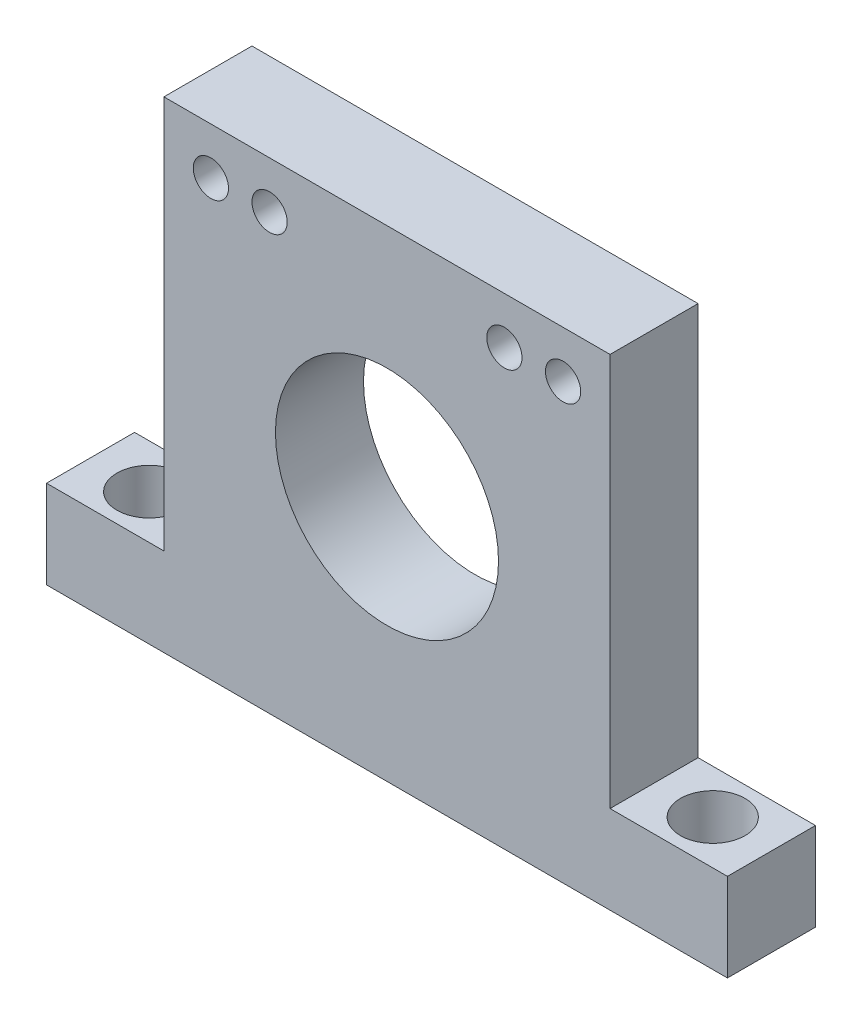
ISO-10303-21;
HEADER;
FILE_DESCRIPTION(('STEP AP214'),'2;1');
FILE_NAME('part.step','',(''),(''),'','','');
FILE_SCHEMA(('AUTOMOTIVE_DESIGN { 1 0 10303 214 1 1 1 1 }'));
ENDSEC;
DATA;
#1=APPLICATION_CONTEXT('core data for automotive mechanical design processes');
#2=APPLICATION_PROTOCOL_DEFINITION('international standard','automotive_design',2000,#1);
#3=PRODUCT_CONTEXT('',#1,'mechanical');
#4=PRODUCT('Part','Part','',(#3));
#5=PRODUCT_RELATED_PRODUCT_CATEGORY('part','',(#4));
#6=PRODUCT_DEFINITION_FORMATION('','',#4);
#7=PRODUCT_DEFINITION_CONTEXT('part definition',#1,'design');
#8=PRODUCT_DEFINITION('design','',#6,#7);
#9=PRODUCT_DEFINITION_SHAPE('','',#8);
#10=(LENGTH_UNIT() NAMED_UNIT(*) SI_UNIT(.MILLI.,.METRE.));
#11=(NAMED_UNIT(*) PLANE_ANGLE_UNIT() SI_UNIT($,.RADIAN.));
#12=(NAMED_UNIT(*) SI_UNIT($,.STERADIAN.) SOLID_ANGLE_UNIT());
#13=UNCERTAINTY_MEASURE_WITH_UNIT(LENGTH_MEASURE(1.E-05),#10,'distance_accuracy_value','');
#14=(GEOMETRIC_REPRESENTATION_CONTEXT(3) GLOBAL_UNCERTAINTY_ASSIGNED_CONTEXT((#13)) GLOBAL_UNIT_ASSIGNED_CONTEXT((#10,
#11,#12)) REPRESENTATION_CONTEXT('',''));
#15=CARTESIAN_POINT('',(0.,0.,0.));
#16=DIRECTION('',(0.,0.,1.));
#17=DIRECTION('',(1.,0.,0.));
#18=AXIS2_PLACEMENT_3D('',#15,#16,#17);
#19=CARTESIAN_POINT('',(-19.,41.,-7.50000000000001));
#20=DIRECTION('',(-1.,0.,0.));
#21=DIRECTION('',(0.,-1.,0.));
#22=AXIS2_PLACEMENT_3D('',#19,#20,#21);
#23=PLANE('',#22);
#24=DIRECTION('',(0.,-1.,0.));
#25=VECTOR('',#24,1.);
#26=CARTESIAN_POINT('',(-19.,41.,0.));
#27=LINE('',#26,#25);
#28=CARTESIAN_POINT('',(-19.,41.,0.));
#29=VERTEX_POINT('',#28);
#30=CARTESIAN_POINT('',(-19.,7.50000000000003,0.));
#31=VERTEX_POINT('',#30);
#32=EDGE_CURVE('E138',#29,#31,#27,.T.);
#33=ORIENTED_EDGE('',*,*,#32,.F.);
#34=DIRECTION('',(0.,0.,1.));
#35=VECTOR('',#34,1.);
#36=CARTESIAN_POINT('',(-19.,41.,-7.50000000000001));
#37=LINE('',#36,#35);
#38=CARTESIAN_POINT('',(-19.,41.,-7.50000000000001));
#39=VERTEX_POINT('',#38);
#40=EDGE_CURVE('E11',#39,#29,#37,.T.);
#41=ORIENTED_EDGE('',*,*,#40,.F.);
#42=DIRECTION('',(0.,-1.,0.));
#43=VECTOR('',#42,1.);
#44=CARTESIAN_POINT('',(-19.,41.,-7.50000000000001));
#45=LINE('',#44,#43);
#46=CARTESIAN_POINT('',(-19.,7.50000000000003,-7.50000000000001));
#47=VERTEX_POINT('',#46);
#48=EDGE_CURVE('E159',#39,#47,#45,.T.);
#49=ORIENTED_EDGE('',*,*,#48,.T.);
#50=DIRECTION('',(0.,0.,1.));
#51=VECTOR('',#50,1.);
#52=CARTESIAN_POINT('',(-19.,7.50000000000003,-7.50000000000001));
#53=LINE('',#52,#51);
#54=EDGE_CURVE('E44',#47,#31,#53,.T.);
#55=ORIENTED_EDGE('',*,*,#54,.T.);
#56=EDGE_LOOP('',(#33,#41,#49,#55));
#57=FACE_BOUND('',#56,.T.);
#58=ADVANCED_FACE('F41',(#57),#23,.T.);
#59=CARTESIAN_POINT('',(19.,41.,-7.50000000000003));
#60=DIRECTION('',(0.,1.,0.));
#61=DIRECTION('',(0.,0.,1.));
#62=AXIS2_PLACEMENT_3D('',#59,#60,#61);
#63=PLANE('',#62);
#64=DIRECTION('',(-1.,0.,0.));
#65=VECTOR('',#64,1.);
#66=CARTESIAN_POINT('',(19.,41.,0.));
#67=LINE('',#66,#65);
#68=CARTESIAN_POINT('',(19.,41.,0.));
#69=VERTEX_POINT('',#68);
#70=EDGE_CURVE('E157',#69,#29,#67,.T.);
#71=ORIENTED_EDGE('',*,*,#70,.F.);
#72=DIRECTION('',(0.,0.,1.));
#73=VECTOR('',#72,1.);
#74=CARTESIAN_POINT('',(19.,41.,-7.50000000000003));
#75=LINE('',#74,#73);
#76=CARTESIAN_POINT('',(19.,41.,-7.50000000000003));
#77=VERTEX_POINT('',#76);
#78=EDGE_CURVE('E50',#77,#69,#75,.T.);
#79=ORIENTED_EDGE('',*,*,#78,.F.);
#80=DIRECTION('',(-1.,0.,0.));
#81=VECTOR('',#80,1.);
#82=CARTESIAN_POINT('',(19.,41.,-7.50000000000003));
#83=LINE('',#82,#81);
#84=EDGE_CURVE('E128',#77,#39,#83,.T.);
#85=ORIENTED_EDGE('',*,*,#84,.T.);
#86=ORIENTED_EDGE('',*,*,#40,.T.);
#87=EDGE_LOOP('',(#71,#79,#85,#86));
#88=FACE_BOUND('',#87,.T.);
#89=ADVANCED_FACE('F171',(#88),#63,.T.);
#90=CARTESIAN_POINT('',(19.,7.50000000000001,-7.50000000000005));
#91=DIRECTION('',(1.,0.,0.));
#92=DIRECTION('',(0.,1.,0.));
#93=AXIS2_PLACEMENT_3D('',#90,#91,#92);
#94=PLANE('',#93);
#95=DIRECTION('',(0.,1.,0.));
#96=VECTOR('',#95,1.);
#97=CARTESIAN_POINT('',(19.,7.50000000000003,0.));
#98=LINE('',#97,#96);
#99=CARTESIAN_POINT('',(19.,7.50000000000003,0.));
#100=VERTEX_POINT('',#99);
#101=EDGE_CURVE('E115',#100,#69,#98,.T.);
#102=ORIENTED_EDGE('',*,*,#101,.F.);
#103=DIRECTION('',(0.,0.,1.));
#104=VECTOR('',#103,1.);
#105=CARTESIAN_POINT('',(19.,7.50000000000001,-7.50000000000005));
#106=LINE('',#105,#104);
#107=CARTESIAN_POINT('',(19.,7.50000000000001,-7.50000000000005));
#108=VERTEX_POINT('',#107);
#109=EDGE_CURVE('E110',#108,#100,#106,.T.);
#110=ORIENTED_EDGE('',*,*,#109,.F.);
#111=DIRECTION('',(0.,1.,0.));
#112=VECTOR('',#111,1.);
#113=CARTESIAN_POINT('',(19.,7.50000000000001,-7.50000000000005));
#114=LINE('',#113,#112);
#115=EDGE_CURVE('E113',#108,#77,#114,.T.);
#116=ORIENTED_EDGE('',*,*,#115,.T.);
#117=ORIENTED_EDGE('',*,*,#78,.T.);
#118=EDGE_LOOP('',(#102,#110,#116,#117));
#119=FACE_BOUND('',#118,.T.);
#120=ADVANCED_FACE('F112',(#119),#94,.T.);
#121=CARTESIAN_POINT('',(29.,7.50000000000003,-7.50000000000003));
#122=DIRECTION('',(0.,1.,0.));
#123=DIRECTION('',(-1.,0.,0.));
#124=AXIS2_PLACEMENT_3D('',#121,#122,#123);
#125=PLANE('',#124);
#126=CARTESIAN_POINT('',(24.,7.50000000000006,-3.75000000000003));
#127=DIRECTION('',(0.,1.,0.));
#128=DIRECTION('',(-1.,0.,0.));
#129=AXIS2_PLACEMENT_3D('',#126,#127,#128);
#130=CIRCLE('',#129,2.75);
#131=CARTESIAN_POINT('',(21.25,7.50000000000006,-3.75000000000003));
#132=VERTEX_POINT('',#131);
#133=EDGE_CURVE('E207',#132,#132,#130,.T.);
#134=ORIENTED_EDGE('',*,*,#133,.F.);
#135=EDGE_LOOP('',(#134));
#136=FACE_BOUND('',#135,.T.);
#137=DIRECTION('',(-1.,0.,0.));
#138=VECTOR('',#137,1.);
#139=CARTESIAN_POINT('',(29.,7.50000000000003,0.));
#140=LINE('',#139,#138);
#141=CARTESIAN_POINT('',(29.,7.50000000000003,0.));
#142=VERTEX_POINT('',#141);
#143=EDGE_CURVE('E154',#142,#100,#140,.T.);
#144=ORIENTED_EDGE('',*,*,#143,.F.);
#145=DIRECTION('',(0.,0.,1.));
#146=VECTOR('',#145,1.);
#147=CARTESIAN_POINT('',(29.,7.50000000000003,-7.50000000000003));
#148=LINE('',#147,#146);
#149=CARTESIAN_POINT('',(29.,7.50000000000003,-7.50000000000003));
#150=VERTEX_POINT('',#149);
#151=EDGE_CURVE('E120',#150,#142,#148,.T.);
#152=ORIENTED_EDGE('',*,*,#151,.F.);
#153=DIRECTION('',(-1.,0.,0.));
#154=VECTOR('',#153,1.);
#155=CARTESIAN_POINT('',(29.,7.50000000000003,-7.50000000000003));
#156=LINE('',#155,#154);
#157=EDGE_CURVE('E126',#150,#108,#156,.T.);
#158=ORIENTED_EDGE('',*,*,#157,.T.);
#159=ORIENTED_EDGE('',*,*,#109,.T.);
#160=EDGE_LOOP('',(#144,#152,#158,#159));
#161=FACE_BOUND('',#160,.T.);
#162=ADVANCED_FACE('F130',(#136,#161),#125,.T.);
#163=CARTESIAN_POINT('',(29.,0.,-7.50000000000001));
#164=DIRECTION('',(1.,0.,0.));
#165=DIRECTION('',(0.,0.,-1.));
#166=AXIS2_PLACEMENT_3D('',#163,#164,#165);
#167=PLANE('',#166);
#168=DIRECTION('',(0.,1.,0.));
#169=VECTOR('',#168,1.);
#170=CARTESIAN_POINT('',(29.,0.,0.));
#171=LINE('',#170,#169);
#172=CARTESIAN_POINT('',(29.,0.,0.));
#173=VERTEX_POINT('',#172);
#174=EDGE_CURVE('E151',#173,#142,#171,.T.);
#175=ORIENTED_EDGE('',*,*,#174,.F.);
#176=DIRECTION('',(0.,0.,1.));
#177=VECTOR('',#176,1.);
#178=CARTESIAN_POINT('',(29.,0.,-7.50000000000001));
#179=LINE('',#178,#177);
#180=CARTESIAN_POINT('',(29.,0.,-7.50000000000001));
#181=VERTEX_POINT('',#180);
#182=EDGE_CURVE('E163',#181,#173,#179,.T.);
#183=ORIENTED_EDGE('',*,*,#182,.F.);
#184=DIRECTION('',(0.,1.,0.));
#185=VECTOR('',#184,1.);
#186=CARTESIAN_POINT('',(29.,0.,-7.50000000000001));
#187=LINE('',#186,#185);
#188=EDGE_CURVE('E131',#181,#150,#187,.T.);
#189=ORIENTED_EDGE('',*,*,#188,.T.);
#190=ORIENTED_EDGE('',*,*,#151,.T.);
#191=EDGE_LOOP('',(#175,#183,#189,#190));
#192=FACE_BOUND('',#191,.T.);
#193=ADVANCED_FACE('F184',(#192),#167,.T.);
#194=CARTESIAN_POINT('',(-29.,0.,-7.50000000000001));
#195=DIRECTION('',(0.,-1.,0.));
#196=DIRECTION('',(1.,0.,0.));
#197=AXIS2_PLACEMENT_3D('',#194,#195,#196);
#198=PLANE('',#197);
#199=CARTESIAN_POINT('',(-24.,0.,-3.75));
#200=DIRECTION('',(0.,1.,0.));
#201=DIRECTION('',(-1.,0.,0.));
#202=AXIS2_PLACEMENT_3D('',#199,#200,#201);
#203=CIRCLE('',#202,2.75);
#204=CARTESIAN_POINT('',(-26.75,0.,-3.75));
#205=VERTEX_POINT('',#204);
#206=EDGE_CURVE('E206',#205,#205,#203,.T.);
#207=ORIENTED_EDGE('',*,*,#206,.T.);
#208=EDGE_LOOP('',(#207));
#209=FACE_BOUND('',#208,.T.);
#210=CARTESIAN_POINT('',(24.,0.,-3.75000000000003));
#211=DIRECTION('',(0.,1.,0.));
#212=DIRECTION('',(-1.,0.,0.));
#213=AXIS2_PLACEMENT_3D('',#210,#211,#212);
#214=CIRCLE('',#213,2.75);
#215=CARTESIAN_POINT('',(21.25,0.,-3.75000000000003));
#216=VERTEX_POINT('',#215);
#217=EDGE_CURVE('E213',#216,#216,#214,.T.);
#218=ORIENTED_EDGE('',*,*,#217,.T.);
#219=EDGE_LOOP('',(#218));
#220=FACE_BOUND('',#219,.T.);
#221=DIRECTION('',(1.,0.,0.));
#222=VECTOR('',#221,1.);
#223=CARTESIAN_POINT('',(-29.,0.,0.));
#224=LINE('',#223,#222);
#225=CARTESIAN_POINT('',(-29.,0.,0.));
#226=VERTEX_POINT('',#225);
#227=EDGE_CURVE('E148',#226,#173,#224,.T.);
#228=ORIENTED_EDGE('',*,*,#227,.F.);
#229=DIRECTION('',(0.,0.,1.));
#230=VECTOR('',#229,1.);
#231=CARTESIAN_POINT('',(-29.,0.,-7.50000000000001));
#232=LINE('',#231,#230);
#233=CARTESIAN_POINT('',(-29.,0.,-7.50000000000001));
#234=VERTEX_POINT('',#233);
#235=EDGE_CURVE('E165',#234,#226,#232,.T.);
#236=ORIENTED_EDGE('',*,*,#235,.F.);
#237=DIRECTION('',(1.,0.,0.));
#238=VECTOR('',#237,1.);
#239=CARTESIAN_POINT('',(-29.,0.,-7.50000000000001));
#240=LINE('',#239,#238);
#241=EDGE_CURVE('E133',#234,#181,#240,.T.);
#242=ORIENTED_EDGE('',*,*,#241,.T.);
#243=ORIENTED_EDGE('',*,*,#182,.T.);
#244=EDGE_LOOP('',(#228,#236,#242,#243));
#245=FACE_BOUND('',#244,.T.);
#246=ADVANCED_FACE('F188',(#209,#220,#245),#198,.T.);
#247=CARTESIAN_POINT('',(-29.,7.49999999999998,-7.50000000000003));
#248=DIRECTION('',(-1.,0.,0.));
#249=DIRECTION('',(0.,0.,1.));
#250=AXIS2_PLACEMENT_3D('',#247,#248,#249);
#251=PLANE('',#250);
#252=DIRECTION('',(0.,-1.,0.));
#253=VECTOR('',#252,1.);
#254=CARTESIAN_POINT('',(-29.,7.50000000000003,0.));
#255=LINE('',#254,#253);
#256=CARTESIAN_POINT('',(-29.,7.50000000000003,0.));
#257=VERTEX_POINT('',#256);
#258=EDGE_CURVE('E145',#257,#226,#255,.T.);
#259=ORIENTED_EDGE('',*,*,#258,.F.);
#260=DIRECTION('',(0.,0.,1.));
#261=VECTOR('',#260,1.);
#262=CARTESIAN_POINT('',(-29.,7.49999999999998,-7.50000000000003));
#263=LINE('',#262,#261);
#264=CARTESIAN_POINT('',(-29.,7.49999999999998,-7.50000000000003));
#265=VERTEX_POINT('',#264);
#266=EDGE_CURVE('E166',#265,#257,#263,.T.);
#267=ORIENTED_EDGE('',*,*,#266,.F.);
#268=DIRECTION('',(0.,-1.,0.));
#269=VECTOR('',#268,1.);
#270=CARTESIAN_POINT('',(-29.,7.49999999999998,-7.50000000000003));
#271=LINE('',#270,#269);
#272=EDGE_CURVE('E249',#265,#234,#271,.T.);
#273=ORIENTED_EDGE('',*,*,#272,.T.);
#274=ORIENTED_EDGE('',*,*,#235,.T.);
#275=EDGE_LOOP('',(#259,#267,#273,#274));
#276=FACE_BOUND('',#275,.T.);
#277=ADVANCED_FACE('F192',(#276),#251,.T.);
#278=CARTESIAN_POINT('',(-19.,7.50000000000003,-7.50000000000001));
#279=DIRECTION('',(0.,1.,0.));
#280=DIRECTION('',(-1.,0.,0.));
#281=AXIS2_PLACEMENT_3D('',#278,#279,#280);
#282=PLANE('',#281);
#283=CARTESIAN_POINT('',(-24.,7.49999999999998,-3.75));
#284=DIRECTION('',(0.,1.,0.));
#285=DIRECTION('',(-1.,0.,0.));
#286=AXIS2_PLACEMENT_3D('',#283,#284,#285);
#287=CIRCLE('',#286,2.75);
#288=CARTESIAN_POINT('',(-26.75,7.49999999999998,-3.75));
#289=VERTEX_POINT('',#288);
#290=EDGE_CURVE('E204',#289,#289,#287,.T.);
#291=ORIENTED_EDGE('',*,*,#290,.F.);
#292=EDGE_LOOP('',(#291));
#293=FACE_BOUND('',#292,.T.);
#294=DIRECTION('',(-1.,0.,0.));
#295=VECTOR('',#294,1.);
#296=CARTESIAN_POINT('',(-19.,7.50000000000003,0.));
#297=LINE('',#296,#295);
#298=EDGE_CURVE('E141',#31,#257,#297,.T.);
#299=ORIENTED_EDGE('',*,*,#298,.F.);
#300=ORIENTED_EDGE('',*,*,#54,.F.);
#301=DIRECTION('',(-1.,0.,0.));
#302=VECTOR('',#301,1.);
#303=CARTESIAN_POINT('',(-19.,7.50000000000003,-7.50000000000001));
#304=LINE('',#303,#302);
#305=EDGE_CURVE('E247',#47,#265,#304,.T.);
#306=ORIENTED_EDGE('',*,*,#305,.T.);
#307=ORIENTED_EDGE('',*,*,#266,.T.);
#308=EDGE_LOOP('',(#299,#300,#306,#307));
#309=FACE_BOUND('',#308,.T.);
#310=ADVANCED_FACE('F168',(#293,#309),#282,.T.);
#311=CARTESIAN_POINT('',(0.,0.,-7.50000000000001));
#312=DIRECTION('',(0.,0.,-1.));
#313=DIRECTION('',(-1.,0.,0.));
#314=AXIS2_PLACEMENT_3D('',#311,#312,#313);
#315=PLANE('',#314);
#316=CARTESIAN_POINT('',(15.,37.,-7.50000000000003));
#317=DIRECTION('',(0.,0.,1.));
#318=DIRECTION('',(1.,0.,0.));
#319=AXIS2_PLACEMENT_3D('',#316,#317,#318);
#320=CIRCLE('',#319,1.5);
#321=CARTESIAN_POINT('',(16.5,37.,-7.50000000000003));
#322=VERTEX_POINT('',#321);
#323=EDGE_CURVE('E218',#322,#322,#320,.T.);
#324=ORIENTED_EDGE('',*,*,#323,.T.);
#325=EDGE_LOOP('',(#324));
#326=FACE_BOUND('',#325,.T.);
#327=CARTESIAN_POINT('',(-10.,37.,-7.50000000000003));
#328=DIRECTION('',(0.,0.,1.));
#329=DIRECTION('',(-1.,0.,0.));
#330=AXIS2_PLACEMENT_3D('',#327,#328,#329);
#331=CIRCLE('',#330,1.5);
#332=CARTESIAN_POINT('',(-11.5,37.,-7.50000000000003));
#333=VERTEX_POINT('',#332);
#334=EDGE_CURVE('E210',#333,#333,#331,.T.);
#335=ORIENTED_EDGE('',*,*,#334,.T.);
#336=EDGE_LOOP('',(#335));
#337=FACE_BOUND('',#336,.T.);
#338=CARTESIAN_POINT('',(-15.0000000000001,37.,-7.50000000000003));
#339=DIRECTION('',(0.,0.,1.));
#340=DIRECTION('',(-1.,0.,0.));
#341=AXIS2_PLACEMENT_3D('',#338,#339,#340);
#342=CIRCLE('',#341,1.5);
#343=CARTESIAN_POINT('',(-16.5000000000001,37.,-7.50000000000003));
#344=VERTEX_POINT('',#343);
#345=EDGE_CURVE('E229',#344,#344,#342,.T.);
#346=ORIENTED_EDGE('',*,*,#345,.T.);
#347=EDGE_LOOP('',(#346));
#348=FACE_BOUND('',#347,.T.);
#349=CARTESIAN_POINT('',(10.,37.,-7.50000000000003));
#350=DIRECTION('',(0.,0.,1.));
#351=DIRECTION('',(1.,0.,0.));
#352=AXIS2_PLACEMENT_3D('',#349,#350,#351);
#353=CIRCLE('',#352,1.5);
#354=CARTESIAN_POINT('',(11.5,37.,-7.50000000000003));
#355=VERTEX_POINT('',#354);
#356=EDGE_CURVE('E234',#355,#355,#353,.T.);
#357=ORIENTED_EDGE('',*,*,#356,.T.);
#358=EDGE_LOOP('',(#357));
#359=FACE_BOUND('',#358,.T.);
#360=CARTESIAN_POINT('',(0.,21.,-7.50000000000001));
#361=DIRECTION('',(0.,0.,1.));
#362=DIRECTION('',(1.,0.,0.));
#363=AXIS2_PLACEMENT_3D('',#360,#361,#362);
#364=CIRCLE('',#363,9.5);
#365=CARTESIAN_POINT('',(9.5,21.,-7.50000000000001));
#366=VERTEX_POINT('',#365);
#367=EDGE_CURVE('E142',#366,#366,#364,.T.);
#368=ORIENTED_EDGE('',*,*,#367,.T.);
#369=EDGE_LOOP('',(#368));
#370=FACE_BOUND('',#369,.T.);
#371=ORIENTED_EDGE('',*,*,#48,.F.);
#372=ORIENTED_EDGE('',*,*,#84,.F.);
#373=ORIENTED_EDGE('',*,*,#115,.F.);
#374=ORIENTED_EDGE('',*,*,#157,.F.);
#375=ORIENTED_EDGE('',*,*,#188,.F.);
#376=ORIENTED_EDGE('',*,*,#241,.F.);
#377=ORIENTED_EDGE('',*,*,#272,.F.);
#378=ORIENTED_EDGE('',*,*,#305,.F.);
#379=EDGE_LOOP('',(#371,#372,#373,#374,#375,#376,#377,#378));
#380=FACE_BOUND('',#379,.T.);
#381=ADVANCED_FACE('F124',(#326,#337,#348,#359,#370,#380),#315,.T.);
#382=CARTESIAN_POINT('',(0.,0.,0.));
#383=DIRECTION('',(0.,0.,-1.));
#384=DIRECTION('',(-1.,0.,0.));
#385=AXIS2_PLACEMENT_3D('',#382,#383,#384);
#386=PLANE('',#385);
#387=CARTESIAN_POINT('',(15.,37.,0.));
#388=DIRECTION('',(0.,0.,1.));
#389=DIRECTION('',(1.,0.,0.));
#390=AXIS2_PLACEMENT_3D('',#387,#388,#389);
#391=CIRCLE('',#390,1.5);
#392=CARTESIAN_POINT('',(16.5,37.,0.));
#393=VERTEX_POINT('',#392);
#394=EDGE_CURVE('E222',#393,#393,#391,.T.);
#395=ORIENTED_EDGE('',*,*,#394,.F.);
#396=EDGE_LOOP('',(#395));
#397=FACE_BOUND('',#396,.T.);
#398=CARTESIAN_POINT('',(-9.99999999999998,37.,0.));
#399=DIRECTION('',(0.,0.,1.));
#400=DIRECTION('',(-1.,0.,0.));
#401=AXIS2_PLACEMENT_3D('',#398,#399,#400);
#402=CIRCLE('',#401,1.5);
#403=CARTESIAN_POINT('',(-11.5,37.,0.));
#404=VERTEX_POINT('',#403);
#405=EDGE_CURVE('E226',#404,#404,#402,.T.);
#406=ORIENTED_EDGE('',*,*,#405,.F.);
#407=EDGE_LOOP('',(#406));
#408=FACE_BOUND('',#407,.T.);
#409=CARTESIAN_POINT('',(-15.,37.,0.));
#410=DIRECTION('',(0.,0.,1.));
#411=DIRECTION('',(-1.,0.,0.));
#412=AXIS2_PLACEMENT_3D('',#409,#410,#411);
#413=CIRCLE('',#412,1.5);
#414=CARTESIAN_POINT('',(-16.5,37.,0.));
#415=VERTEX_POINT('',#414);
#416=EDGE_CURVE('E237',#415,#415,#413,.T.);
#417=ORIENTED_EDGE('',*,*,#416,.F.);
#418=EDGE_LOOP('',(#417));
#419=FACE_BOUND('',#418,.T.);
#420=CARTESIAN_POINT('',(9.99999999999997,37.,0.));
#421=DIRECTION('',(0.,0.,1.));
#422=DIRECTION('',(1.,0.,0.));
#423=AXIS2_PLACEMENT_3D('',#420,#421,#422);
#424=CIRCLE('',#423,1.5);
#425=CARTESIAN_POINT('',(11.5,37.,0.));
#426=VERTEX_POINT('',#425);
#427=EDGE_CURVE('E225',#426,#426,#424,.T.);
#428=ORIENTED_EDGE('',*,*,#427,.F.);
#429=EDGE_LOOP('',(#428));
#430=FACE_BOUND('',#429,.T.);
#431=CARTESIAN_POINT('',(0.,21.,0.));
#432=DIRECTION('',(0.,0.,1.));
#433=DIRECTION('',(1.,0.,0.));
#434=AXIS2_PLACEMENT_3D('',#431,#432,#433);
#435=CIRCLE('',#434,9.5);
#436=CARTESIAN_POINT('',(9.50000000000003,21.,0.));
#437=VERTEX_POINT('',#436);
#438=EDGE_CURVE('E221',#437,#437,#435,.T.);
#439=ORIENTED_EDGE('',*,*,#438,.F.);
#440=EDGE_LOOP('',(#439));
#441=FACE_BOUND('',#440,.T.);
#442=ORIENTED_EDGE('',*,*,#32,.T.);
#443=ORIENTED_EDGE('',*,*,#298,.T.);
#444=ORIENTED_EDGE('',*,*,#258,.T.);
#445=ORIENTED_EDGE('',*,*,#227,.T.);
#446=ORIENTED_EDGE('',*,*,#174,.T.);
#447=ORIENTED_EDGE('',*,*,#143,.T.);
#448=ORIENTED_EDGE('',*,*,#101,.T.);
#449=ORIENTED_EDGE('',*,*,#70,.T.);
#450=EDGE_LOOP('',(#442,#443,#444,#445,#446,#447,#448,#449));
#451=FACE_BOUND('',#450,.T.);
#452=ADVANCED_FACE('F170',(#397,#408,#419,#430,#441,#451),#386,.F.);
#453=CARTESIAN_POINT('',(0.,21.,-7.50000000000001));
#454=DIRECTION('',(0.,0.,1.));
#455=DIRECTION('',(1.,0.,0.));
#456=AXIS2_PLACEMENT_3D('',#453,#454,#455);
#457=CYLINDRICAL_SURFACE('',#456,9.5);
#458=ORIENTED_EDGE('',*,*,#367,.F.);
#459=EDGE_LOOP('',(#458));
#460=FACE_BOUND('',#459,.T.);
#461=ORIENTED_EDGE('',*,*,#438,.T.);
#462=EDGE_LOOP('',(#461));
#463=FACE_BOUND('',#462,.T.);
#464=ADVANCED_FACE('F259',(#460,#463),#457,.F.);
#465=CARTESIAN_POINT('',(10.,37.,-7.50000000000003));
#466=DIRECTION('',(0.,0.,1.));
#467=DIRECTION('',(1.,0.,0.));
#468=AXIS2_PLACEMENT_3D('',#465,#466,#467);
#469=CYLINDRICAL_SURFACE('',#468,1.5);
#470=ORIENTED_EDGE('',*,*,#356,.F.);
#471=EDGE_LOOP('',(#470));
#472=FACE_BOUND('',#471,.T.);
#473=ORIENTED_EDGE('',*,*,#427,.T.);
#474=EDGE_LOOP('',(#473));
#475=FACE_BOUND('',#474,.T.);
#476=ADVANCED_FACE('F266',(#472,#475),#469,.F.);
#477=CARTESIAN_POINT('',(-15.0000000000001,37.,-7.50000000000003));
#478=DIRECTION('',(0.,0.,1.));
#479=DIRECTION('',(1.,0.,0.));
#480=AXIS2_PLACEMENT_3D('',#477,#478,#479);
#481=CYLINDRICAL_SURFACE('',#480,1.5);
#482=ORIENTED_EDGE('',*,*,#345,.F.);
#483=EDGE_LOOP('',(#482));
#484=FACE_BOUND('',#483,.T.);
#485=ORIENTED_EDGE('',*,*,#416,.T.);
#486=EDGE_LOOP('',(#485));
#487=FACE_BOUND('',#486,.T.);
#488=ADVANCED_FACE('F278',(#484,#487),#481,.F.);
#489=CARTESIAN_POINT('',(-10.,37.,-7.50000000000003));
#490=DIRECTION('',(0.,0.,1.));
#491=DIRECTION('',(1.,0.,0.));
#492=AXIS2_PLACEMENT_3D('',#489,#490,#491);
#493=CYLINDRICAL_SURFACE('',#492,1.5);
#494=ORIENTED_EDGE('',*,*,#334,.F.);
#495=EDGE_LOOP('',(#494));
#496=FACE_BOUND('',#495,.T.);
#497=ORIENTED_EDGE('',*,*,#405,.T.);
#498=EDGE_LOOP('',(#497));
#499=FACE_BOUND('',#498,.T.);
#500=ADVANCED_FACE('F284',(#496,#499),#493,.F.);
#501=CARTESIAN_POINT('',(15.,37.,-7.50000000000003));
#502=DIRECTION('',(0.,0.,1.));
#503=DIRECTION('',(1.,0.,0.));
#504=AXIS2_PLACEMENT_3D('',#501,#502,#503);
#505=CYLINDRICAL_SURFACE('',#504,1.5);
#506=ORIENTED_EDGE('',*,*,#323,.F.);
#507=EDGE_LOOP('',(#506));
#508=FACE_BOUND('',#507,.T.);
#509=ORIENTED_EDGE('',*,*,#394,.T.);
#510=EDGE_LOOP('',(#509));
#511=FACE_BOUND('',#510,.T.);
#512=ADVANCED_FACE('F291',(#508,#511),#505,.F.);
#513=CARTESIAN_POINT('',(-24.,0.,-3.75));
#514=DIRECTION('',(0.,1.,0.));
#515=DIRECTION('',(-1.,0.,0.));
#516=AXIS2_PLACEMENT_3D('',#513,#514,#515);
#517=CYLINDRICAL_SURFACE('',#516,2.75);
#518=CARTESIAN_POINT('',(-26.75,0.,-3.75));
#519=CARTESIAN_POINT('',(-26.75,0.0781249999999994,-3.75));
#520=CARTESIAN_POINT('',(-26.75,0.156249999999999,-3.75));
#521=CARTESIAN_POINT('',(-26.75,0.312499999999999,-3.75));
#522=CARTESIAN_POINT('',(-26.75,0.390624999999999,-3.75));
#523=CARTESIAN_POINT('',(-26.75,0.546874999999998,-3.75));
#524=CARTESIAN_POINT('',(-26.75,0.624999999999998,-3.75));
#525=CARTESIAN_POINT('',(-26.75,0.781249999999997,-3.75));
#526=CARTESIAN_POINT('',(-26.75,0.859374999999997,-3.75));
#527=CARTESIAN_POINT('',(-26.75,1.015625,-3.75));
#528=CARTESIAN_POINT('',(-26.75,1.09375,-3.75));
#529=CARTESIAN_POINT('',(-26.75,1.25,-3.75));
#530=CARTESIAN_POINT('',(-26.75,1.328125,-3.75));
#531=CARTESIAN_POINT('',(-26.75,1.484375,-3.75));
#532=CARTESIAN_POINT('',(-26.75,1.5625,-3.75));
#533=CARTESIAN_POINT('',(-26.75,1.71874999999999,-3.75));
#534=CARTESIAN_POINT('',(-26.75,1.79687499999999,-3.75));
#535=CARTESIAN_POINT('',(-26.75,1.95312499999999,-3.75));
#536=CARTESIAN_POINT('',(-26.75,2.03124999999999,-3.75));
#537=CARTESIAN_POINT('',(-26.75,2.18749999999999,-3.75));
#538=CARTESIAN_POINT('',(-26.75,2.26562499999999,-3.75));
#539=CARTESIAN_POINT('',(-26.75,2.42187499999999,-3.75));
#540=CARTESIAN_POINT('',(-26.75,2.49999999999999,-3.75));
#541=CARTESIAN_POINT('',(-26.75,2.65624999999999,-3.75));
#542=CARTESIAN_POINT('',(-26.75,2.73437499999999,-3.75));
#543=CARTESIAN_POINT('',(-26.75,2.89062499999999,-3.75));
#544=CARTESIAN_POINT('',(-26.75,2.96874999999999,-3.75));
#545=CARTESIAN_POINT('',(-26.75,3.12499999999999,-3.75));
#546=CARTESIAN_POINT('',(-26.75,3.20312499999999,-3.75));
#547=CARTESIAN_POINT('',(-26.75,3.35937499999999,-3.75));
#548=CARTESIAN_POINT('',(-26.75,3.43749999999999,-3.75));
#549=CARTESIAN_POINT('',(-26.75,3.59374999999999,-3.75));
#550=CARTESIAN_POINT('',(-26.75,3.67187499999999,-3.75));
#551=CARTESIAN_POINT('',(-26.75,3.82812499999999,-3.75));
#552=CARTESIAN_POINT('',(-26.75,3.90624999999999,-3.75));
#553=CARTESIAN_POINT('',(-26.75,4.06249999999999,-3.75));
#554=CARTESIAN_POINT('',(-26.75,4.14062499999999,-3.75));
#555=CARTESIAN_POINT('',(-26.75,4.29687499999999,-3.75));
#556=CARTESIAN_POINT('',(-26.75,4.37499999999999,-3.75));
#557=CARTESIAN_POINT('',(-26.75,4.53124999999999,-3.75));
#558=CARTESIAN_POINT('',(-26.75,4.60937499999999,-3.75));
#559=CARTESIAN_POINT('',(-26.75,4.76562499999999,-3.75));
#560=CARTESIAN_POINT('',(-26.75,4.84374999999998,-3.75));
#561=CARTESIAN_POINT('',(-26.75,4.99999999999999,-3.75));
#562=CARTESIAN_POINT('',(-26.75,5.07812499999998,-3.75));
#563=CARTESIAN_POINT('',(-26.75,5.23437499999998,-3.75));
#564=CARTESIAN_POINT('',(-26.75,5.31249999999998,-3.75));
#565=CARTESIAN_POINT('',(-26.75,5.46874999999998,-3.75));
#566=CARTESIAN_POINT('',(-26.75,5.54687499999998,-3.75));
#567=CARTESIAN_POINT('',(-26.75,5.70312499999998,-3.75));
#568=CARTESIAN_POINT('',(-26.75,5.78124999999998,-3.75));
#569=CARTESIAN_POINT('',(-26.75,5.93749999999998,-3.75));
#570=CARTESIAN_POINT('',(-26.75,6.01562499999998,-3.75));
#571=CARTESIAN_POINT('',(-26.75,6.17187499999998,-3.75));
#572=CARTESIAN_POINT('',(-26.75,6.24999999999998,-3.75));
#573=CARTESIAN_POINT('',(-26.75,6.40624999999998,-3.75));
#574=CARTESIAN_POINT('',(-26.75,6.48437499999998,-3.75));
#575=CARTESIAN_POINT('',(-26.75,6.64062499999998,-3.75));
#576=CARTESIAN_POINT('',(-26.75,6.71874999999998,-3.75));
#577=CARTESIAN_POINT('',(-26.75,6.87499999999998,-3.75));
#578=CARTESIAN_POINT('',(-26.75,6.95312499999998,-3.75));
#579=CARTESIAN_POINT('',(-26.75,7.10937499999998,-3.75));
#580=CARTESIAN_POINT('',(-26.75,7.18749999999998,-3.75));
#581=CARTESIAN_POINT('',(-26.75,7.34374999999998,-3.75));
#582=CARTESIAN_POINT('',(-26.75,7.42187499999998,-3.75));
#583=CARTESIAN_POINT('',(-26.75,7.49999999999998,-3.75));
#584=B_SPLINE_CURVE_WITH_KNOTS('',3,(#518,#519,#520,#521,#522,#523,#524,#525,#526,#527,#528,
#529,#530,#531,#532,#533,#534,#535,#536,#537,#538,#539,#540,#541,#542,#543,#544,#545,#546,#547,
#548,#549,#550,#551,#552,#553,#554,#555,#556,#557,#558,#559,#560,#561,#562,#563,#564,#565,#566,
#567,#568,#569,#570,#571,#572,#573,#574,#575,#576,#577,#578,#579,#580,#581,#582,#583),
.UNSPECIFIED.,.F.,.F.,(4,2,2,2,2,2,2,2,2,2,2,2,2,2,2,2,2,2,2,2,2,2,2,2,2,2,2,2,2,2,2,2,4),(0.,
0.234374999999999,0.468749999999999,0.703124999999998,0.937499999999997,1.171875,1.40625,
1.640625,1.87499999999999,2.10937499999999,2.34374999999999,2.57812499999999,2.81249999999999,
3.04687499999999,3.28124999999999,3.51562499999999,3.74999999999999,3.98437499999999,
4.21874999999999,4.45312499999999,4.68749999999999,4.92187499999998,5.15624999999998,
5.39062499999998,5.62499999999998,5.85937499999998,6.09374999999998,6.32812499999998,
6.56249999999998,6.79687499999998,7.03124999999998,7.26562499999998,7.49999999999998),.UNSPECIFIED.);
#585=EDGE_CURVE('BSEAM295',#205,#289,#584,.T.);
#586=ORIENTED_EDGE('',*,*,#206,.F.);
#587=ORIENTED_EDGE('',*,*,#290,.T.);
#588=ORIENTED_EDGE('',*,*,#585,.T.);
#589=ORIENTED_EDGE('',*,*,#585,.F.);
#590=EDGE_LOOP('',(#586,#588,#587,#589));
#591=FACE_BOUND('',#590,.T.);
#592=ADVANCED_FACE('F295',(#591),#517,.F.);
#593=CARTESIAN_POINT('',(24.,0.,-3.75000000000003));
#594=DIRECTION('',(0.,1.,0.));
#595=DIRECTION('',(-1.,0.,0.));
#596=AXIS2_PLACEMENT_3D('',#593,#594,#595);
#597=CYLINDRICAL_SURFACE('',#596,2.75);
#598=CARTESIAN_POINT('',(21.25,0.,-3.75000000000003));
#599=CARTESIAN_POINT('',(21.25,0.0781250000000002,-3.75000000000003));
#600=CARTESIAN_POINT('',(21.25,0.156250000000001,-3.75000000000003));
#601=CARTESIAN_POINT('',(21.25,0.312500000000002,-3.75000000000003));
#602=CARTESIAN_POINT('',(21.25,0.390625000000003,-3.75000000000003));
#603=CARTESIAN_POINT('',(21.25,0.546875000000004,-3.75000000000003));
#604=CARTESIAN_POINT('',(21.25,0.625000000000005,-3.75000000000003));
#605=CARTESIAN_POINT('',(21.25,0.781250000000006,-3.75000000000003));
#606=CARTESIAN_POINT('',(21.25,0.859375000000007,-3.75000000000003));
#607=CARTESIAN_POINT('',(21.25,1.01562500000001,-3.75000000000003));
#608=CARTESIAN_POINT('',(21.25,1.09375000000001,-3.75000000000003));
#609=CARTESIAN_POINT('',(21.25,1.25000000000001,-3.75000000000003));
#610=CARTESIAN_POINT('',(21.25,1.32812500000001,-3.75000000000003));
#611=CARTESIAN_POINT('',(21.25,1.48437500000001,-3.75000000000003));
#612=CARTESIAN_POINT('',(21.25,1.56250000000001,-3.75000000000003));
#613=CARTESIAN_POINT('',(21.25,1.71875000000001,-3.75000000000003));
#614=CARTESIAN_POINT('',(21.25,1.79687500000001,-3.75000000000003));
#615=CARTESIAN_POINT('',(21.25,1.95312500000002,-3.75000000000003));
#616=CARTESIAN_POINT('',(21.25,2.03125000000002,-3.75000000000003));
#617=CARTESIAN_POINT('',(21.25,2.18750000000002,-3.75000000000003));
#618=CARTESIAN_POINT('',(21.25,2.26562500000002,-3.75000000000003));
#619=CARTESIAN_POINT('',(21.25,2.42187500000002,-3.75000000000003));
#620=CARTESIAN_POINT('',(21.25,2.50000000000002,-3.75000000000003));
#621=CARTESIAN_POINT('',(21.25,2.65625000000002,-3.75000000000003));
#622=CARTESIAN_POINT('',(21.25,2.73437500000002,-3.75000000000003));
#623=CARTESIAN_POINT('',(21.25,2.89062500000002,-3.75000000000003));
#624=CARTESIAN_POINT('',(21.25,2.96875000000002,-3.75000000000003));
#625=CARTESIAN_POINT('',(21.25,3.12500000000003,-3.75000000000003));
#626=CARTESIAN_POINT('',(21.25,3.20312500000003,-3.75000000000003));
#627=CARTESIAN_POINT('',(21.25,3.35937500000003,-3.75000000000003));
#628=CARTESIAN_POINT('',(21.25,3.43750000000003,-3.75000000000003));
#629=CARTESIAN_POINT('',(21.25,3.59375000000003,-3.75000000000003));
#630=CARTESIAN_POINT('',(21.25,3.67187500000003,-3.75000000000003));
#631=CARTESIAN_POINT('',(21.25,3.82812500000003,-3.75000000000003));
#632=CARTESIAN_POINT('',(21.25,3.90625000000003,-3.75000000000003));
#633=CARTESIAN_POINT('',(21.25,4.06250000000003,-3.75000000000003));
#634=CARTESIAN_POINT('',(21.25,4.14062500000003,-3.75000000000003));
#635=CARTESIAN_POINT('',(21.25,4.29687500000003,-3.75000000000003));
#636=CARTESIAN_POINT('',(21.25,4.37500000000004,-3.75000000000003));
#637=CARTESIAN_POINT('',(21.25,4.53125000000004,-3.75000000000003));
#638=CARTESIAN_POINT('',(21.25,4.60937500000004,-3.75000000000003));
#639=CARTESIAN_POINT('',(21.25,4.76562500000004,-3.75000000000003));
#640=CARTESIAN_POINT('',(21.25,4.84375000000004,-3.75000000000003));
#641=CARTESIAN_POINT('',(21.25,5.00000000000004,-3.75000000000003));
#642=CARTESIAN_POINT('',(21.25,5.07812500000004,-3.75000000000003));
#643=CARTESIAN_POINT('',(21.25,5.23437500000004,-3.75000000000003));
#644=CARTESIAN_POINT('',(21.25,5.31250000000004,-3.75000000000003));
#645=CARTESIAN_POINT('',(21.25,5.46875000000004,-3.75000000000003));
#646=CARTESIAN_POINT('',(21.25,5.54687500000005,-3.75000000000003));
#647=CARTESIAN_POINT('',(21.25,5.70312500000005,-3.75000000000003));
#648=CARTESIAN_POINT('',(21.25,5.78125000000005,-3.75000000000003));
#649=CARTESIAN_POINT('',(21.25,5.93750000000005,-3.75000000000003));
#650=CARTESIAN_POINT('',(21.25,6.01562500000005,-3.75000000000003));
#651=CARTESIAN_POINT('',(21.25,6.17187500000005,-3.75000000000003));
#652=CARTESIAN_POINT('',(21.25,6.25000000000005,-3.75000000000003));
#653=CARTESIAN_POINT('',(21.25,6.40625000000005,-3.75000000000003));
#654=CARTESIAN_POINT('',(21.25,6.48437500000005,-3.75000000000003));
#655=CARTESIAN_POINT('',(21.25,6.64062500000005,-3.75000000000003));
#656=CARTESIAN_POINT('',(21.25,6.71875000000005,-3.75000000000003));
#657=CARTESIAN_POINT('',(21.25,6.87500000000006,-3.75000000000003));
#658=CARTESIAN_POINT('',(21.25,6.95312500000006,-3.75000000000003));
#659=CARTESIAN_POINT('',(21.25,7.10937500000006,-3.75000000000003));
#660=CARTESIAN_POINT('',(21.25,7.18750000000006,-3.75000000000003));
#661=CARTESIAN_POINT('',(21.25,7.34375000000006,-3.75000000000003));
#662=CARTESIAN_POINT('',(21.25,7.42187500000006,-3.75000000000003));
#663=CARTESIAN_POINT('',(21.25,7.50000000000006,-3.75000000000003));
#664=B_SPLINE_CURVE_WITH_KNOTS('',3,(#598,#599,#600,#601,#602,#603,#604,#605,#606,#607,#608,
#609,#610,#611,#612,#613,#614,#615,#616,#617,#618,#619,#620,#621,#622,#623,#624,#625,#626,#627,
#628,#629,#630,#631,#632,#633,#634,#635,#636,#637,#638,#639,#640,#641,#642,#643,#644,#645,#646,
#647,#648,#649,#650,#651,#652,#653,#654,#655,#656,#657,#658,#659,#660,#661,#662,#663),
.UNSPECIFIED.,.F.,.F.,(4,2,2,2,2,2,2,2,2,2,2,2,2,2,2,2,2,2,2,2,2,2,2,2,2,2,2,2,2,2,2,2,4),(0.,
0.234375000000002,0.468750000000004,0.703125000000006,0.937500000000008,1.17187500000001,
1.40625000000001,1.64062500000001,1.87500000000002,2.10937500000002,2.34375000000002,
2.57812500000002,2.81250000000002,3.04687500000003,3.28125000000003,3.51562500000003,
3.75000000000003,3.98437500000003,4.21875000000003,4.45312500000004,4.68750000000004,
4.92187500000004,5.15625000000004,5.39062500000004,5.62500000000005,5.85937500000005,
6.09375000000005,6.32812500000005,6.56250000000005,6.79687500000006,7.03125000000006,
7.26562500000006,7.50000000000006),.UNSPECIFIED.);
#665=EDGE_CURVE('BSEAM297',#216,#132,#664,.T.);
#666=ORIENTED_EDGE('',*,*,#217,.F.);
#667=ORIENTED_EDGE('',*,*,#133,.T.);
#668=ORIENTED_EDGE('',*,*,#665,.T.);
#669=ORIENTED_EDGE('',*,*,#665,.F.);
#670=EDGE_LOOP('',(#666,#668,#667,#669));
#671=FACE_BOUND('',#670,.T.);
#672=ADVANCED_FACE('F297',(#671),#597,.F.);
#673=CLOSED_SHELL('',(#58,#89,#120,#162,#193,#246,#277,#310,#381,#452,#464,#476,#488,#500,#512,
#592,#672));
#674=MANIFOLD_SOLID_BREP('B2',#673);
#675=ADVANCED_BREP_SHAPE_REPRESENTATION('',(#18,#674),#14);
#676=SHAPE_DEFINITION_REPRESENTATION(#9,#675);
ENDSEC;
END-ISO-10303-21;
